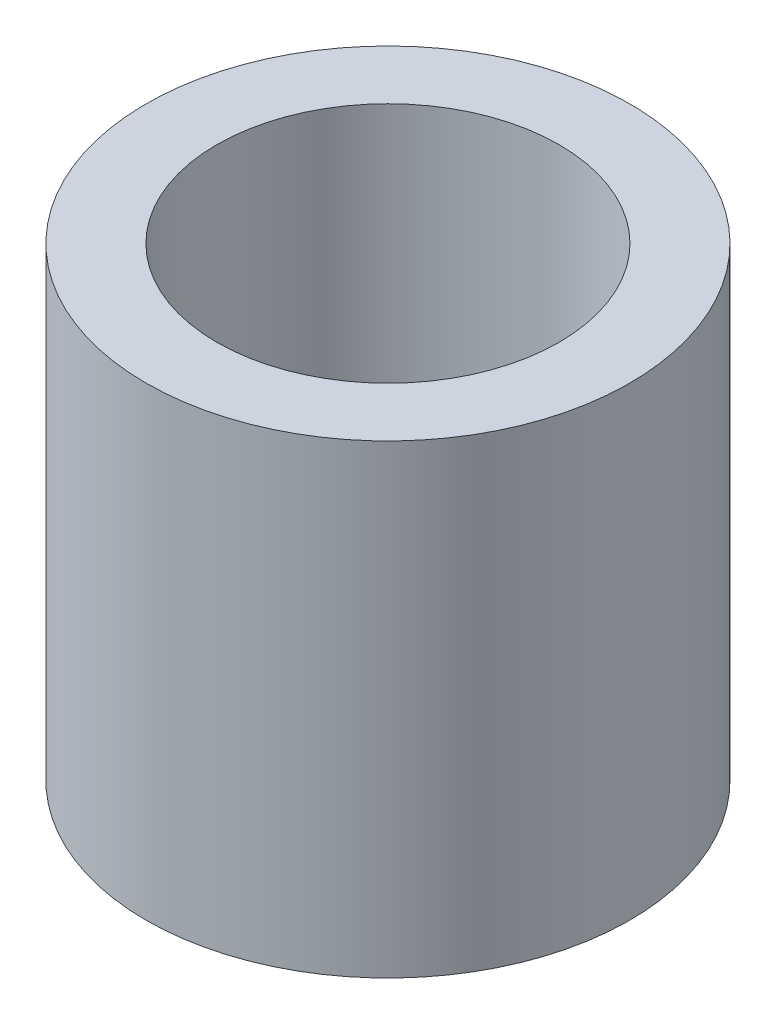
ISO-10303-21;
HEADER;
FILE_DESCRIPTION(('STEP AP214'),'2;1');
FILE_NAME('part.step','',(''),(''),'','','');
FILE_SCHEMA(('AUTOMOTIVE_DESIGN { 1 0 10303 214 1 1 1 1 }'));
ENDSEC;
DATA;
#1=APPLICATION_CONTEXT('core data for automotive mechanical design processes');
#2=APPLICATION_PROTOCOL_DEFINITION('international standard','automotive_design',2000,#1);
#3=PRODUCT_CONTEXT('',#1,'mechanical');
#4=PRODUCT('Part','Part','',(#3));
#5=PRODUCT_RELATED_PRODUCT_CATEGORY('part','',(#4));
#6=PRODUCT_DEFINITION_FORMATION('','',#4);
#7=PRODUCT_DEFINITION_CONTEXT('part definition',#1,'design');
#8=PRODUCT_DEFINITION('design','',#6,#7);
#9=PRODUCT_DEFINITION_SHAPE('','',#8);
#10=(LENGTH_UNIT() NAMED_UNIT(*) SI_UNIT(.MILLI.,.METRE.));
#11=(NAMED_UNIT(*) PLANE_ANGLE_UNIT() SI_UNIT($,.RADIAN.));
#12=(NAMED_UNIT(*) SI_UNIT($,.STERADIAN.) SOLID_ANGLE_UNIT());
#13=UNCERTAINTY_MEASURE_WITH_UNIT(LENGTH_MEASURE(1.E-05),#10,'distance_accuracy_value','');
#14=(GEOMETRIC_REPRESENTATION_CONTEXT(3) GLOBAL_UNCERTAINTY_ASSIGNED_CONTEXT((#13)) GLOBAL_UNIT_ASSIGNED_CONTEXT((#10,
#11,#12)) REPRESENTATION_CONTEXT('',''));
#15=CARTESIAN_POINT('',(0.,0.,0.));
#16=DIRECTION('',(0.,0.,1.));
#17=DIRECTION('',(1.,0.,0.));
#18=AXIS2_PLACEMENT_3D('',#15,#16,#17);
#19=CARTESIAN_POINT('',(0.,3.175,0.));
#20=DIRECTION('',(0.,1.,0.));
#21=DIRECTION('',(0.,0.,1.));
#22=AXIS2_PLACEMENT_3D('',#19,#20,#21);
#23=PLANE('',#22);
#24=CARTESIAN_POINT('',(0.,3.175,0.));
#25=DIRECTION('',(0.,1.,0.));
#26=DIRECTION('',(0.,0.,1.));
#27=AXIS2_PLACEMENT_3D('',#24,#25,#26);
#28=CIRCLE('',#27,1.651);
#29=CARTESIAN_POINT('',(0.,3.175,1.651));
#30=VERTEX_POINT('',#29);
#31=EDGE_CURVE('E10',#30,#30,#28,.T.);
#32=ORIENTED_EDGE('',*,*,#31,.T.);
#33=EDGE_LOOP('',(#32));
#34=FACE_BOUND('',#33,.T.);
#35=CARTESIAN_POINT('',(0.,3.175,0.));
#36=DIRECTION('',(0.,1.,0.));
#37=DIRECTION('',(0.,0.,1.));
#38=AXIS2_PLACEMENT_3D('',#35,#36,#37);
#39=CIRCLE('',#38,1.1684);
#40=CARTESIAN_POINT('',(0.,3.175,1.1684));
#41=VERTEX_POINT('',#40);
#42=EDGE_CURVE('E51',#41,#41,#39,.T.);
#43=ORIENTED_EDGE('',*,*,#42,.F.);
#44=EDGE_LOOP('',(#43));
#45=FACE_BOUND('',#44,.T.);
#46=ADVANCED_FACE('F38',(#34,#45),#23,.T.);
#47=CARTESIAN_POINT('',(0.,0.,0.));
#48=DIRECTION('',(0.,1.,0.));
#49=DIRECTION('',(0.,0.,1.));
#50=AXIS2_PLACEMENT_3D('',#47,#48,#49);
#51=PLANE('',#50);
#52=CARTESIAN_POINT('',(0.,0.,0.));
#53=DIRECTION('',(0.,1.,0.));
#54=DIRECTION('',(0.,0.,1.));
#55=AXIS2_PLACEMENT_3D('',#52,#53,#54);
#56=CIRCLE('',#55,1.651);
#57=CARTESIAN_POINT('',(0.,0.,1.651));
#58=VERTEX_POINT('',#57);
#59=EDGE_CURVE('E42',#58,#58,#56,.T.);
#60=ORIENTED_EDGE('',*,*,#59,.F.);
#61=EDGE_LOOP('',(#60));
#62=FACE_BOUND('',#61,.T.);
#63=CARTESIAN_POINT('',(0.,0.,0.));
#64=DIRECTION('',(0.,1.,0.));
#65=DIRECTION('',(0.,0.,1.));
#66=AXIS2_PLACEMENT_3D('',#63,#64,#65);
#67=CIRCLE('',#66,1.1684);
#68=CARTESIAN_POINT('',(0.,0.,1.1684));
#69=VERTEX_POINT('',#68);
#70=EDGE_CURVE('E53',#69,#69,#67,.T.);
#71=ORIENTED_EDGE('',*,*,#70,.T.);
#72=EDGE_LOOP('',(#71));
#73=FACE_BOUND('',#72,.T.);
#74=ADVANCED_FACE('F65',(#62,#73),#51,.F.);
#75=CARTESIAN_POINT('',(0.,3.175,0.));
#76=DIRECTION('',(0.,-1.,0.));
#77=DIRECTION('',(0.,0.,-1.));
#78=AXIS2_PLACEMENT_3D('',#75,#76,#77);
#79=CYLINDRICAL_SURFACE('',#78,1.651);
#80=ORIENTED_EDGE('',*,*,#31,.F.);
#81=EDGE_LOOP('',(#80));
#82=FACE_BOUND('',#81,.T.);
#83=ORIENTED_EDGE('',*,*,#59,.T.);
#84=EDGE_LOOP('',(#83));
#85=FACE_BOUND('',#84,.T.);
#86=ADVANCED_FACE('F40',(#82,#85),#79,.T.);
#87=CARTESIAN_POINT('',(0.,3.175,0.));
#88=DIRECTION('',(0.,-1.,0.));
#89=DIRECTION('',(0.,0.,-1.));
#90=AXIS2_PLACEMENT_3D('',#87,#88,#89);
#91=CYLINDRICAL_SURFACE('',#90,1.1684);
#92=ORIENTED_EDGE('',*,*,#42,.T.);
#93=EDGE_LOOP('',(#92));
#94=FACE_BOUND('',#93,.T.);
#95=ORIENTED_EDGE('',*,*,#70,.F.);
#96=EDGE_LOOP('',(#95));
#97=FACE_BOUND('',#96,.T.);
#98=ADVANCED_FACE('F61',(#94,#97),#91,.F.);
#99=CLOSED_SHELL('',(#46,#74,#86,#98));
#100=MANIFOLD_SOLID_BREP('B2',#99);
#101=ADVANCED_BREP_SHAPE_REPRESENTATION('',(#18,#100),#14);
#102=SHAPE_DEFINITION_REPRESENTATION(#9,#101);
ENDSEC;
END-ISO-10303-21;
